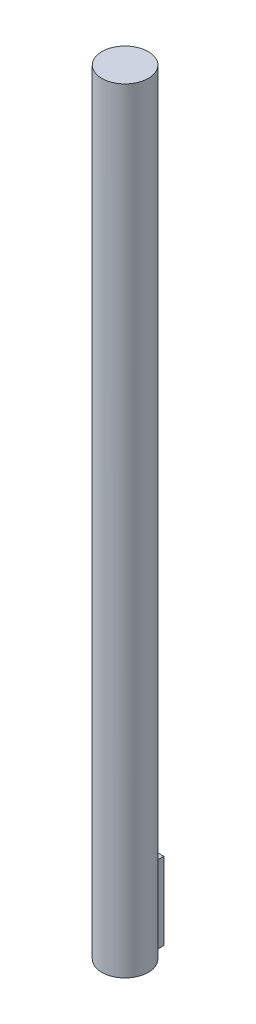
ISO-10303-21;
HEADER;
FILE_DESCRIPTION(('STEP AP214'),'2;1');
FILE_NAME('part.step','',(''),(''),'','','');
FILE_SCHEMA(('AUTOMOTIVE_DESIGN { 1 0 10303 214 1 1 1 1 }'));
ENDSEC;
DATA;
#1=APPLICATION_CONTEXT('core data for automotive mechanical design processes');
#2=APPLICATION_PROTOCOL_DEFINITION('international standard','automotive_design',2000,#1);
#3=PRODUCT_CONTEXT('',#1,'mechanical');
#4=PRODUCT('Part','Part','',(#3));
#5=PRODUCT_RELATED_PRODUCT_CATEGORY('part','',(#4));
#6=PRODUCT_DEFINITION_FORMATION('','',#4);
#7=PRODUCT_DEFINITION_CONTEXT('part definition',#1,'design');
#8=PRODUCT_DEFINITION('design','',#6,#7);
#9=PRODUCT_DEFINITION_SHAPE('','',#8);
#10=(LENGTH_UNIT() NAMED_UNIT(*) SI_UNIT(.MILLI.,.METRE.));
#11=(NAMED_UNIT(*) PLANE_ANGLE_UNIT() SI_UNIT($,.RADIAN.));
#12=(NAMED_UNIT(*) SI_UNIT($,.STERADIAN.) SOLID_ANGLE_UNIT());
#13=UNCERTAINTY_MEASURE_WITH_UNIT(LENGTH_MEASURE(1.E-05),#10,'distance_accuracy_value','');
#14=(GEOMETRIC_REPRESENTATION_CONTEXT(3) GLOBAL_UNCERTAINTY_ASSIGNED_CONTEXT((#13)) GLOBAL_UNIT_ASSIGNED_CONTEXT((#10,
#11,#12)) REPRESENTATION_CONTEXT('',''));
#15=CARTESIAN_POINT('',(0.,0.,0.));
#16=DIRECTION('',(0.,0.,1.));
#17=DIRECTION('',(1.,0.,0.));
#18=AXIS2_PLACEMENT_3D('',#15,#16,#17);
#19=CARTESIAN_POINT('',(0.,100.,0.));
#20=DIRECTION('',(0.,-1.,0.));
#21=DIRECTION('',(0.,0.,-1.));
#22=AXIS2_PLACEMENT_3D('',#19,#20,#21);
#23=CYLINDRICAL_SURFACE('',#22,3.);
#24=CARTESIAN_POINT('',(0.,100.,0.));
#25=DIRECTION('',(0.,1.,0.));
#26=DIRECTION('',(0.,0.,1.));
#27=AXIS2_PLACEMENT_3D('',#24,#25,#26);
#28=CIRCLE('',#27,3.);
#29=CARTESIAN_POINT('',(0.,100.,3.));
#30=VERTEX_POINT('',#29);
#31=EDGE_CURVE('E41',#30,#30,#28,.T.);
#32=ORIENTED_EDGE('',*,*,#31,.F.);
#33=EDGE_LOOP('',(#32));
#34=FACE_BOUND('',#33,.T.);
#35=DIRECTION('',(0.,-1.,0.));
#36=VECTOR('',#35,1.);
#37=CARTESIAN_POINT('',(1.,100.,-2.82842712474619));
#38=LINE('',#37,#36);
#39=CARTESIAN_POINT('',(1.,9.99999999999999,-2.82842712474619));
#40=VERTEX_POINT('',#39);
#41=CARTESIAN_POINT('',(1.,0.,-2.82842712474619));
#42=VERTEX_POINT('',#41);
#43=EDGE_CURVE('E51',#40,#42,#38,.T.);
#44=ORIENTED_EDGE('',*,*,#43,.F.);
#45=CARTESIAN_POINT('',(0.,9.99999999999999,0.));
#46=DIRECTION('',(0.,1.,0.));
#47=DIRECTION('',(0.,0.,1.));
#48=AXIS2_PLACEMENT_3D('',#45,#46,#47);
#49=CIRCLE('',#48,3.);
#50=CARTESIAN_POINT('',(-1.,9.99999999999999,-2.82842712474619));
#51=VERTEX_POINT('',#50);
#52=EDGE_CURVE('E11',#40,#51,#49,.T.);
#53=ORIENTED_EDGE('',*,*,#52,.T.);
#54=DIRECTION('',(0.,-1.,0.));
#55=VECTOR('',#54,1.);
#56=CARTESIAN_POINT('',(-1.,100.,-2.82842712474619));
#57=LINE('',#56,#55);
#58=CARTESIAN_POINT('',(-1.,0.,-2.82842712474619));
#59=VERTEX_POINT('',#58);
#60=EDGE_CURVE('E93',#59,#51,#57,.F.);
#61=ORIENTED_EDGE('',*,*,#60,.F.);
#62=CARTESIAN_POINT('',(0.,0.,0.));
#63=DIRECTION('',(0.,1.,0.));
#64=DIRECTION('',(0.,0.,1.));
#65=AXIS2_PLACEMENT_3D('',#62,#63,#64);
#66=CIRCLE('',#65,3.);
#67=EDGE_CURVE('E100',#59,#42,#66,.T.);
#68=ORIENTED_EDGE('',*,*,#67,.T.);
#69=EDGE_LOOP('',(#44,#53,#61,#68));
#70=FACE_BOUND('',#69,.T.);
#71=ADVANCED_FACE('F34',(#34,#70),#23,.T.);
#72=CARTESIAN_POINT('',(0.,100.,0.));
#73=DIRECTION('',(0.,1.,0.));
#74=DIRECTION('',(0.,0.,1.));
#75=AXIS2_PLACEMENT_3D('',#72,#73,#74);
#76=PLANE('',#75);
#77=ORIENTED_EDGE('',*,*,#31,.T.);
#78=EDGE_LOOP('',(#77));
#79=FACE_BOUND('',#78,.T.);
#80=ADVANCED_FACE('F122',(#79),#76,.T.);
#81=CARTESIAN_POINT('',(0.,0.,0.));
#82=DIRECTION('',(0.,1.,0.));
#83=DIRECTION('',(0.,0.,1.));
#84=AXIS2_PLACEMENT_3D('',#81,#82,#83);
#85=PLANE('',#84);
#86=ORIENTED_EDGE('',*,*,#67,.F.);
#87=DIRECTION('',(0.,0.,1.));
#88=VECTOR('',#87,1.);
#89=CARTESIAN_POINT('',(-1.,0.,-4.));
#90=LINE('',#89,#88);
#91=CARTESIAN_POINT('',(-1.,0.,-4.));
#92=VERTEX_POINT('',#91);
#93=EDGE_CURVE('E78',#92,#59,#90,.T.);
#94=ORIENTED_EDGE('',*,*,#93,.F.);
#95=DIRECTION('',(-1.,0.,0.));
#96=VECTOR('',#95,1.);
#97=CARTESIAN_POINT('',(-1.,0.,-4.));
#98=LINE('',#97,#96);
#99=CARTESIAN_POINT('',(1.,0.,-4.));
#100=VERTEX_POINT('',#99);
#101=EDGE_CURVE('E106',#100,#92,#98,.T.);
#102=ORIENTED_EDGE('',*,*,#101,.F.);
#103=DIRECTION('',(0.,0.,-1.));
#104=VECTOR('',#103,1.);
#105=CARTESIAN_POINT('',(1.,0.,-4.));
#106=LINE('',#105,#104);
#107=EDGE_CURVE('E91',#42,#100,#106,.T.);
#108=ORIENTED_EDGE('',*,*,#107,.F.);
#109=EDGE_LOOP('',(#86,#94,#102,#108));
#110=FACE_BOUND('',#109,.T.);
#111=ADVANCED_FACE('F105',(#110),#85,.F.);
#112=CARTESIAN_POINT('',(1.,10.,-4.));
#113=DIRECTION('',(-1.,0.,0.));
#114=DIRECTION('',(0.,0.,1.));
#115=AXIS2_PLACEMENT_3D('',#112,#113,#114);
#116=PLANE('',#115);
#117=DIRECTION('',(0.,0.,-1.));
#118=VECTOR('',#117,1.);
#119=CARTESIAN_POINT('',(1.,10.,-4.));
#120=LINE('',#119,#118);
#121=CARTESIAN_POINT('',(1.,10.,-4.));
#122=VERTEX_POINT('',#121);
#123=EDGE_CURVE('E70',#40,#122,#120,.T.);
#124=ORIENTED_EDGE('',*,*,#123,.F.);
#125=ORIENTED_EDGE('',*,*,#43,.T.);
#126=ORIENTED_EDGE('',*,*,#107,.T.);
#127=DIRECTION('',(0.,-1.,0.));
#128=VECTOR('',#127,1.);
#129=CARTESIAN_POINT('',(1.,10.,-4.));
#130=LINE('',#129,#128);
#131=EDGE_CURVE('E83',#122,#100,#130,.T.);
#132=ORIENTED_EDGE('',*,*,#131,.F.);
#133=EDGE_LOOP('',(#124,#125,#126,#132));
#134=FACE_BOUND('',#133,.T.);
#135=ADVANCED_FACE('F89',(#134),#116,.F.);
#136=CARTESIAN_POINT('',(-1.,10.,-4.));
#137=DIRECTION('',(1.,0.,0.));
#138=DIRECTION('',(0.,0.,-1.));
#139=AXIS2_PLACEMENT_3D('',#136,#137,#138);
#140=PLANE('',#139);
#141=ORIENTED_EDGE('',*,*,#93,.T.);
#142=ORIENTED_EDGE('',*,*,#60,.T.);
#143=DIRECTION('',(0.,0.,1.));
#144=VECTOR('',#143,1.);
#145=CARTESIAN_POINT('',(-1.,10.,-4.));
#146=LINE('',#145,#144);
#147=CARTESIAN_POINT('',(-1.,10.,-4.));
#148=VERTEX_POINT('',#147);
#149=EDGE_CURVE('E87',#148,#51,#146,.T.);
#150=ORIENTED_EDGE('',*,*,#149,.F.);
#151=DIRECTION('',(0.,-1.,0.));
#152=VECTOR('',#151,1.);
#153=CARTESIAN_POINT('',(-1.,10.,-4.));
#154=LINE('',#153,#152);
#155=EDGE_CURVE('E85',#148,#92,#154,.T.);
#156=ORIENTED_EDGE('',*,*,#155,.T.);
#157=EDGE_LOOP('',(#141,#142,#150,#156));
#158=FACE_BOUND('',#157,.T.);
#159=ADVANCED_FACE('F111',(#158),#140,.F.);
#160=CARTESIAN_POINT('',(-1.,10.,-4.));
#161=DIRECTION('',(0.,0.,1.));
#162=DIRECTION('',(1.,0.,0.));
#163=AXIS2_PLACEMENT_3D('',#160,#161,#162);
#164=PLANE('',#163);
#165=ORIENTED_EDGE('',*,*,#101,.T.);
#166=ORIENTED_EDGE('',*,*,#155,.F.);
#167=DIRECTION('',(-1.,0.,0.));
#168=VECTOR('',#167,1.);
#169=CARTESIAN_POINT('',(-1.,10.,-4.));
#170=LINE('',#169,#168);
#171=EDGE_CURVE('E74',#122,#148,#170,.T.);
#172=ORIENTED_EDGE('',*,*,#171,.F.);
#173=ORIENTED_EDGE('',*,*,#131,.T.);
#174=EDGE_LOOP('',(#165,#166,#172,#173));
#175=FACE_BOUND('',#174,.T.);
#176=ADVANCED_FACE('F82',(#175),#164,.F.);
#177=CARTESIAN_POINT('',(0.,10.,0.));
#178=DIRECTION('',(0.,1.,0.));
#179=DIRECTION('',(0.,0.,1.));
#180=AXIS2_PLACEMENT_3D('',#177,#178,#179);
#181=PLANE('',#180);
#182=ORIENTED_EDGE('',*,*,#52,.F.);
#183=ORIENTED_EDGE('',*,*,#123,.T.);
#184=ORIENTED_EDGE('',*,*,#171,.T.);
#185=ORIENTED_EDGE('',*,*,#149,.T.);
#186=EDGE_LOOP('',(#182,#183,#184,#185));
#187=FACE_BOUND('',#186,.T.);
#188=ADVANCED_FACE('F72',(#187),#181,.T.);
#189=CLOSED_SHELL('',(#71,#80,#111,#135,#159,#176,#188));
#190=MANIFOLD_SOLID_BREP('B2',#189);
#191=ADVANCED_BREP_SHAPE_REPRESENTATION('',(#18,#190),#14);
#192=SHAPE_DEFINITION_REPRESENTATION(#9,#191);
ENDSEC;
END-ISO-10303-21;
